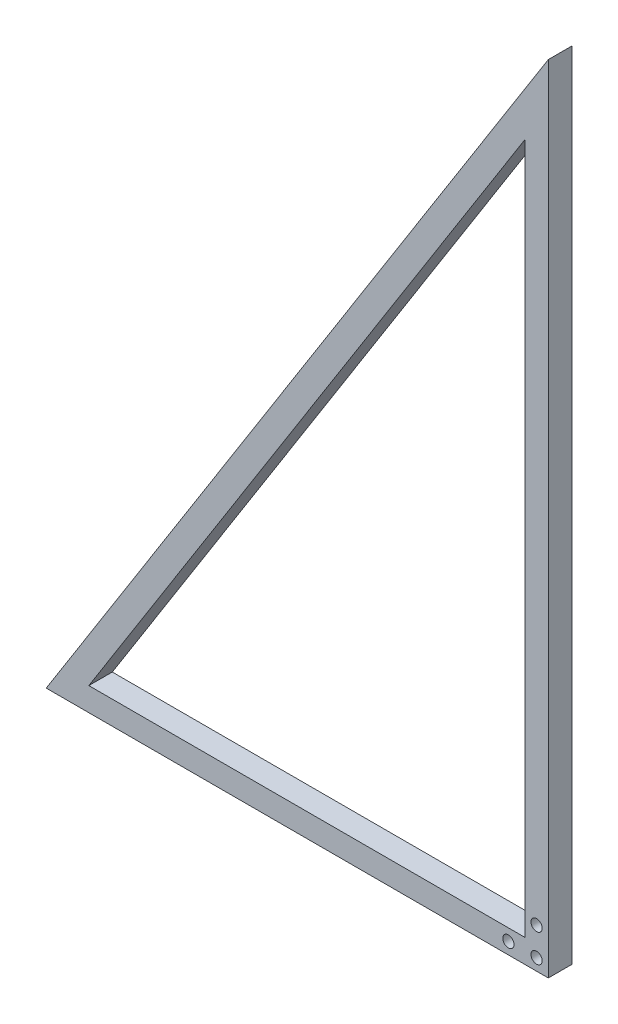
ISO-10303-21;
HEADER;
FILE_DESCRIPTION(('STEP AP214'),'2;1');
FILE_NAME('part.step','',(''),(''),'','','');
FILE_SCHEMA(('AUTOMOTIVE_DESIGN { 1 0 10303 214 1 1 1 1 }'));
ENDSEC;
DATA;
#1=APPLICATION_CONTEXT('core data for automotive mechanical design processes');
#2=APPLICATION_PROTOCOL_DEFINITION('international standard','automotive_design',2000,#1);
#3=PRODUCT_CONTEXT('',#1,'mechanical');
#4=PRODUCT('Part','Part','',(#3));
#5=PRODUCT_RELATED_PRODUCT_CATEGORY('part','',(#4));
#6=PRODUCT_DEFINITION_FORMATION('','',#4);
#7=PRODUCT_DEFINITION_CONTEXT('part definition',#1,'design');
#8=PRODUCT_DEFINITION('design','',#6,#7);
#9=PRODUCT_DEFINITION_SHAPE('','',#8);
#10=(LENGTH_UNIT() NAMED_UNIT(*) SI_UNIT(.MILLI.,.METRE.));
#11=(NAMED_UNIT(*) PLANE_ANGLE_UNIT() SI_UNIT($,.RADIAN.));
#12=(NAMED_UNIT(*) SI_UNIT($,.STERADIAN.) SOLID_ANGLE_UNIT());
#13=UNCERTAINTY_MEASURE_WITH_UNIT(LENGTH_MEASURE(1.E-05),#10,'distance_accuracy_value','');
#14=(GEOMETRIC_REPRESENTATION_CONTEXT(3) GLOBAL_UNCERTAINTY_ASSIGNED_CONTEXT((#13)) GLOBAL_UNIT_ASSIGNED_CONTEXT((#10,
#11,#12)) REPRESENTATION_CONTEXT('',''));
#15=CARTESIAN_POINT('',(0.,0.,0.));
#16=DIRECTION('',(0.,0.,1.));
#17=DIRECTION('',(1.,0.,0.));
#18=AXIS2_PLACEMENT_3D('',#15,#16,#17);
#19=CARTESIAN_POINT('',(-3.12499999999998,100.,3.125));
#20=DIRECTION('',(1.,0.,0.));
#21=DIRECTION('',(0.,1.,0.));
#22=AXIS2_PLACEMENT_3D('',#19,#20,#21);
#23=PLANE('',#22);
#24=DIRECTION('',(0.,-1.,0.));
#25=VECTOR('',#24,1.);
#26=CARTESIAN_POINT('',(-3.12499999999998,100.,3.125));
#27=LINE('',#26,#25);
#28=CARTESIAN_POINT('',(-3.12499999999997,90.0990099009901,3.125));
#29=VERTEX_POINT('',#28);
#30=CARTESIAN_POINT('',(-3.12499999999998,-93.75,3.125));
#31=VERTEX_POINT('',#30);
#32=EDGE_CURVE('E48',#29,#31,#27,.T.);
#33=ORIENTED_EDGE('',*,*,#32,.F.);
#34=DIRECTION('',(0.,0.,-1.));
#35=VECTOR('',#34,1.);
#36=CARTESIAN_POINT('',(-3.12499999999998,90.0990099009901,3.125));
#37=LINE('',#36,#35);
#38=CARTESIAN_POINT('',(-3.12499999999997,90.0990099009901,-3.125));
#39=VERTEX_POINT('',#38);
#40=EDGE_CURVE('E52',#29,#39,#37,.T.);
#41=ORIENTED_EDGE('',*,*,#40,.T.);
#42=DIRECTION('',(0.,-1.,0.));
#43=VECTOR('',#42,1.);
#44=CARTESIAN_POINT('',(-3.12499999999998,100.,-3.125));
#45=LINE('',#44,#43);
#46=CARTESIAN_POINT('',(-3.12499999999998,-93.75,-3.125));
#47=VERTEX_POINT('',#46);
#48=EDGE_CURVE('E132',#39,#47,#45,.T.);
#49=ORIENTED_EDGE('',*,*,#48,.T.);
#50=DIRECTION('',(0.,0.,1.));
#51=VECTOR('',#50,1.);
#52=CARTESIAN_POINT('',(-3.12499999999998,-93.75,-3.125));
#53=LINE('',#52,#51);
#54=EDGE_CURVE('E129',#47,#31,#53,.T.);
#55=ORIENTED_EDGE('',*,*,#54,.T.);
#56=EDGE_LOOP('',(#33,#41,#49,#55));
#57=FACE_BOUND('',#56,.T.);
#58=ADVANCED_FACE('F32',(#57),#23,.F.);
#59=CARTESIAN_POINT('',(-3.12499999999998,-100.,3.125));
#60=DIRECTION('',(0.,1.,0.));
#61=DIRECTION('',(0.,0.,1.));
#62=AXIS2_PLACEMENT_3D('',#59,#60,#61);
#63=PLANE('',#62);
#64=DIRECTION('',(1.,0.,0.));
#65=VECTOR('',#64,1.);
#66=CARTESIAN_POINT('',(-3.12499999999998,-100.,-3.125));
#67=LINE('',#66,#65);
#68=CARTESIAN_POINT('',(-130.516075072184,-100.,-3.125));
#69=VERTEX_POINT('',#68);
#70=CARTESIAN_POINT('',(3.12500000000002,-100.,-3.125));
#71=VERTEX_POINT('',#70);
#72=EDGE_CURVE('E92',#69,#71,#67,.T.);
#73=ORIENTED_EDGE('',*,*,#72,.T.);
#74=DIRECTION('',(0.,0.,-1.));
#75=VECTOR('',#74,1.);
#76=CARTESIAN_POINT('',(3.12500000000002,-100.,3.125));
#77=LINE('',#76,#75);
#78=CARTESIAN_POINT('',(3.12500000000002,-100.,3.125));
#79=VERTEX_POINT('',#78);
#80=EDGE_CURVE('E40',#79,#71,#77,.T.);
#81=ORIENTED_EDGE('',*,*,#80,.F.);
#82=DIRECTION('',(1.,0.,0.));
#83=VECTOR('',#82,1.);
#84=CARTESIAN_POINT('',(-3.12499999999998,-100.,3.125));
#85=LINE('',#84,#83);
#86=CARTESIAN_POINT('',(-130.516075072184,-100.,3.125));
#87=VERTEX_POINT('',#86);
#88=EDGE_CURVE('E309',#87,#79,#85,.T.);
#89=ORIENTED_EDGE('',*,*,#88,.F.);
#90=DIRECTION('',(0.,0.,1.));
#91=VECTOR('',#90,1.);
#92=CARTESIAN_POINT('',(-130.516075072184,-100.,-3.125));
#93=LINE('',#92,#91);
#94=EDGE_CURVE('E100',#69,#87,#93,.T.);
#95=ORIENTED_EDGE('',*,*,#94,.F.);
#96=EDGE_LOOP('',(#73,#81,#89,#95));
#97=FACE_BOUND('',#96,.T.);
#98=ADVANCED_FACE('F171',(#97),#63,.F.);
#99=CARTESIAN_POINT('',(3.12500000000002,100.,3.125));
#100=DIRECTION('',(-1.,0.,0.));
#101=DIRECTION('',(0.,0.,1.));
#102=AXIS2_PLACEMENT_3D('',#99,#100,#101);
#103=PLANE('',#102);
#104=DIRECTION('',(0.,1.,0.));
#105=VECTOR('',#104,1.);
#106=CARTESIAN_POINT('',(3.12500000000002,100.,-3.125));
#107=LINE('',#106,#105);
#108=CARTESIAN_POINT('',(3.12500000000002,111.708633777717,-3.125));
#109=VERTEX_POINT('',#108);
#110=EDGE_CURVE('E84',#71,#109,#107,.T.);
#111=ORIENTED_EDGE('',*,*,#110,.T.);
#112=DIRECTION('',(0.,0.,1.));
#113=VECTOR('',#112,1.);
#114=CARTESIAN_POINT('',(3.12500000000002,111.708633777717,-3.125));
#115=LINE('',#114,#113);
#116=CARTESIAN_POINT('',(3.12500000000002,111.708633777717,3.125));
#117=VERTEX_POINT('',#116);
#118=EDGE_CURVE('E89',#109,#117,#115,.T.);
#119=ORIENTED_EDGE('',*,*,#118,.T.);
#120=DIRECTION('',(0.,1.,0.));
#121=VECTOR('',#120,1.);
#122=CARTESIAN_POINT('',(3.12500000000002,100.,3.125));
#123=LINE('',#122,#121);
#124=EDGE_CURVE('E145',#79,#117,#123,.T.);
#125=ORIENTED_EDGE('',*,*,#124,.F.);
#126=ORIENTED_EDGE('',*,*,#80,.T.);
#127=EDGE_LOOP('',(#111,#119,#125,#126));
#128=FACE_BOUND('',#127,.T.);
#129=ADVANCED_FACE('F86',(#128),#103,.F.);
#130=CARTESIAN_POINT('',(0.,0.,3.125));
#131=DIRECTION('',(0.,0.,1.));
#132=DIRECTION('',(1.,0.,0.));
#133=AXIS2_PLACEMENT_3D('',#130,#131,#132);
#134=PLANE('',#133);
#135=CARTESIAN_POINT('',(-7.49999999999997,-96.875,3.125));
#136=DIRECTION('',(0.,0.,1.));
#137=DIRECTION('',(1.,0.,0.));
#138=AXIS2_PLACEMENT_3D('',#135,#136,#137);
#139=CIRCLE('',#138,1.5);
#140=CARTESIAN_POINT('',(-5.99999999999997,-96.875,3.125));
#141=VERTEX_POINT('',#140);
#142=EDGE_CURVE('E192',#141,#141,#139,.T.);
#143=ORIENTED_EDGE('',*,*,#142,.F.);
#144=EDGE_LOOP('',(#143));
#145=FACE_BOUND('',#144,.T.);
#146=CARTESIAN_POINT('',(0.,-89.375,3.125));
#147=DIRECTION('',(0.,0.,1.));
#148=DIRECTION('',(1.,0.,0.));
#149=AXIS2_PLACEMENT_3D('',#146,#147,#148);
#150=CIRCLE('',#149,1.5);
#151=CARTESIAN_POINT('',(1.5,-89.375,3.125));
#152=VERTEX_POINT('',#151);
#153=EDGE_CURVE('E196',#152,#152,#150,.T.);
#154=ORIENTED_EDGE('',*,*,#153,.F.);
#155=EDGE_LOOP('',(#154));
#156=FACE_BOUND('',#155,.T.);
#157=CARTESIAN_POINT('',(0.,-96.875,3.125));
#158=DIRECTION('',(0.,0.,1.));
#159=DIRECTION('',(1.,0.,0.));
#160=AXIS2_PLACEMENT_3D('',#157,#158,#159);
#161=CIRCLE('',#160,1.5);
#162=CARTESIAN_POINT('',(1.50000000000003,-96.875,3.125));
#163=VERTEX_POINT('',#162);
#164=EDGE_CURVE('E113',#163,#163,#161,.T.);
#165=ORIENTED_EDGE('',*,*,#164,.F.);
#166=EDGE_LOOP('',(#165));
#167=FACE_BOUND('',#166,.T.);
#168=DIRECTION('',(0.533794131634266,0.845614465955272,0.));
#169=VECTOR('',#168,1.);
#170=CARTESIAN_POINT('',(-123.125,-100.,3.125));
#171=LINE('',#170,#169);
#172=CARTESIAN_POINT('',(-119.1796875,-93.75,3.125));
#173=VERTEX_POINT('',#172);
#174=EDGE_CURVE('E107',#173,#29,#171,.T.);
#175=ORIENTED_EDGE('',*,*,#174,.T.);
#176=ORIENTED_EDGE('',*,*,#32,.T.);
#177=DIRECTION('',(-1.,0.,0.));
#178=VECTOR('',#177,1.);
#179=CARTESIAN_POINT('',(-123.125,-93.75,3.125));
#180=LINE('',#179,#178);
#181=EDGE_CURVE('E123',#31,#173,#180,.T.);
#182=ORIENTED_EDGE('',*,*,#181,.T.);
#183=EDGE_LOOP('',(#175,#176,#182));
#184=FACE_BOUND('',#183,.T.);
#185=DIRECTION('',(-0.533794131634265,-0.845614465955272,0.));
#186=VECTOR('',#185,1.);
#187=CARTESIAN_POINT('',(-2.16009041222041,103.336213322714,3.125));
#188=LINE('',#187,#186);
#189=EDGE_CURVE('E106',#117,#87,#188,.T.);
#190=ORIENTED_EDGE('',*,*,#189,.T.);
#191=ORIENTED_EDGE('',*,*,#88,.T.);
#192=ORIENTED_EDGE('',*,*,#124,.T.);
#193=EDGE_LOOP('',(#190,#191,#192));
#194=FACE_BOUND('',#193,.T.);
#195=ADVANCED_FACE('F150',(#145,#156,#167,#184,#194),#134,.T.);
#196=CARTESIAN_POINT('',(0.,0.,-3.125));
#197=DIRECTION('',(0.,0.,1.));
#198=DIRECTION('',(1.,0.,0.));
#199=AXIS2_PLACEMENT_3D('',#196,#197,#198);
#200=PLANE('',#199);
#201=CARTESIAN_POINT('',(-7.49999999999997,-96.875,-3.125));
#202=DIRECTION('',(0.,0.,1.));
#203=DIRECTION('',(1.,0.,0.));
#204=AXIS2_PLACEMENT_3D('',#201,#202,#203);
#205=CIRCLE('',#204,1.5);
#206=CARTESIAN_POINT('',(-5.99999999999997,-96.875,-3.125));
#207=VERTEX_POINT('',#206);
#208=EDGE_CURVE('E35',#207,#207,#205,.T.);
#209=ORIENTED_EDGE('',*,*,#208,.T.);
#210=EDGE_LOOP('',(#209));
#211=FACE_BOUND('',#210,.T.);
#212=CARTESIAN_POINT('',(0.,-89.375,-3.125));
#213=DIRECTION('',(0.,0.,1.));
#214=DIRECTION('',(1.,0.,0.));
#215=AXIS2_PLACEMENT_3D('',#212,#213,#214);
#216=CIRCLE('',#215,1.5);
#217=CARTESIAN_POINT('',(1.5,-89.375,-3.125));
#218=VERTEX_POINT('',#217);
#219=EDGE_CURVE('E200',#218,#218,#216,.T.);
#220=ORIENTED_EDGE('',*,*,#219,.T.);
#221=EDGE_LOOP('',(#220));
#222=FACE_BOUND('',#221,.T.);
#223=CARTESIAN_POINT('',(0.,-96.875,-3.125));
#224=DIRECTION('',(0.,0.,1.));
#225=DIRECTION('',(1.,0.,0.));
#226=AXIS2_PLACEMENT_3D('',#223,#224,#225);
#227=CIRCLE('',#226,1.5);
#228=CARTESIAN_POINT('',(1.50000000000003,-96.875,-3.125));
#229=VERTEX_POINT('',#228);
#230=EDGE_CURVE('E108',#229,#229,#227,.T.);
#231=ORIENTED_EDGE('',*,*,#230,.T.);
#232=EDGE_LOOP('',(#231));
#233=FACE_BOUND('',#232,.T.);
#234=ORIENTED_EDGE('',*,*,#48,.F.);
#235=DIRECTION('',(0.533794131634266,0.845614465955272,0.));
#236=VECTOR('',#235,1.);
#237=CARTESIAN_POINT('',(-123.125,-100.,-3.125));
#238=LINE('',#237,#236);
#239=CARTESIAN_POINT('',(-119.1796875,-93.75,-3.125));
#240=VERTEX_POINT('',#239);
#241=EDGE_CURVE('E101',#240,#39,#238,.T.);
#242=ORIENTED_EDGE('',*,*,#241,.F.);
#243=DIRECTION('',(-1.,0.,0.));
#244=VECTOR('',#243,1.);
#245=CARTESIAN_POINT('',(-123.125,-93.75,-3.125));
#246=LINE('',#245,#244);
#247=EDGE_CURVE('E133',#47,#240,#246,.T.);
#248=ORIENTED_EDGE('',*,*,#247,.F.);
#249=EDGE_LOOP('',(#234,#242,#248));
#250=FACE_BOUND('',#249,.T.);
#251=ORIENTED_EDGE('',*,*,#72,.F.);
#252=DIRECTION('',(-0.533794131634265,-0.845614465955272,0.));
#253=VECTOR('',#252,1.);
#254=CARTESIAN_POINT('',(-2.16009041222041,103.336213322714,-3.125));
#255=LINE('',#254,#253);
#256=EDGE_CURVE('E95',#109,#69,#255,.T.);
#257=ORIENTED_EDGE('',*,*,#256,.F.);
#258=ORIENTED_EDGE('',*,*,#110,.F.);
#259=EDGE_LOOP('',(#251,#257,#258));
#260=FACE_BOUND('',#259,.T.);
#261=ADVANCED_FACE('F96',(#211,#222,#233,#250,#260),#200,.F.);
#262=CARTESIAN_POINT('',(-123.125,-93.75,-3.125));
#263=DIRECTION('',(0.,1.,0.));
#264=DIRECTION('',(-1.,0.,0.));
#265=AXIS2_PLACEMENT_3D('',#262,#263,#264);
#266=PLANE('',#265);
#267=DIRECTION('',(0.,0.,-1.));
#268=VECTOR('',#267,1.);
#269=CARTESIAN_POINT('',(-119.1796875,-93.75,-3.125));
#270=LINE('',#269,#268);
#271=EDGE_CURVE('E11',#173,#240,#270,.T.);
#272=ORIENTED_EDGE('',*,*,#271,.F.);
#273=ORIENTED_EDGE('',*,*,#181,.F.);
#274=ORIENTED_EDGE('',*,*,#54,.F.);
#275=ORIENTED_EDGE('',*,*,#247,.T.);
#276=EDGE_LOOP('',(#272,#273,#274,#275));
#277=FACE_BOUND('',#276,.T.);
#278=ADVANCED_FACE('F155',(#277),#266,.T.);
#279=CARTESIAN_POINT('',(-123.125,-100.,-3.125));
#280=DIRECTION('',(0.845614465955272,-0.533794131634266,0.));
#281=DIRECTION('',(0.533794131634266,0.845614465955272,0.));
#282=AXIS2_PLACEMENT_3D('',#279,#280,#281);
#283=PLANE('',#282);
#284=ORIENTED_EDGE('',*,*,#40,.F.);
#285=ORIENTED_EDGE('',*,*,#174,.F.);
#286=ORIENTED_EDGE('',*,*,#271,.T.);
#287=ORIENTED_EDGE('',*,*,#241,.T.);
#288=EDGE_LOOP('',(#284,#285,#286,#287));
#289=FACE_BOUND('',#288,.T.);
#290=ADVANCED_FACE('F160',(#289),#283,.T.);
#291=CARTESIAN_POINT('',(-2.16009041222041,103.336213322714,-3.125));
#292=DIRECTION('',(-0.845614465955272,0.533794131634265,0.));
#293=DIRECTION('',(-0.533794131634265,-0.845614465955272,0.));
#294=AXIS2_PLACEMENT_3D('',#291,#292,#293);
#295=PLANE('',#294);
#296=ORIENTED_EDGE('',*,*,#189,.F.);
#297=ORIENTED_EDGE('',*,*,#118,.F.);
#298=ORIENTED_EDGE('',*,*,#256,.T.);
#299=ORIENTED_EDGE('',*,*,#94,.T.);
#300=EDGE_LOOP('',(#296,#297,#298,#299));
#301=FACE_BOUND('',#300,.T.);
#302=ADVANCED_FACE('F104',(#301),#295,.T.);
#303=CARTESIAN_POINT('',(0.,-96.875,-13.125));
#304=DIRECTION('',(0.,0.,1.));
#305=DIRECTION('',(1.,0.,0.));
#306=AXIS2_PLACEMENT_3D('',#303,#304,#305);
#307=CYLINDRICAL_SURFACE('',#306,1.5);
#308=ORIENTED_EDGE('',*,*,#164,.T.);
#309=EDGE_LOOP('',(#308));
#310=FACE_BOUND('',#309,.T.);
#311=ORIENTED_EDGE('',*,*,#230,.F.);
#312=EDGE_LOOP('',(#311));
#313=FACE_BOUND('',#312,.T.);
#314=ADVANCED_FACE('F167',(#310,#313),#307,.F.);
#315=CARTESIAN_POINT('',(0.,-89.375,-13.125));
#316=DIRECTION('',(0.,0.,1.));
#317=DIRECTION('',(1.,0.,0.));
#318=AXIS2_PLACEMENT_3D('',#315,#316,#317);
#319=CYLINDRICAL_SURFACE('',#318,1.5);
#320=ORIENTED_EDGE('',*,*,#153,.T.);
#321=EDGE_LOOP('',(#320));
#322=FACE_BOUND('',#321,.T.);
#323=ORIENTED_EDGE('',*,*,#219,.F.);
#324=EDGE_LOOP('',(#323));
#325=FACE_BOUND('',#324,.T.);
#326=ADVANCED_FACE('F211',(#322,#325),#319,.F.);
#327=CARTESIAN_POINT('',(-7.49999999999997,-96.875,-13.125));
#328=DIRECTION('',(0.,0.,1.));
#329=DIRECTION('',(1.,0.,0.));
#330=AXIS2_PLACEMENT_3D('',#327,#328,#329);
#331=CYLINDRICAL_SURFACE('',#330,1.5);
#332=ORIENTED_EDGE('',*,*,#142,.T.);
#333=EDGE_LOOP('',(#332));
#334=FACE_BOUND('',#333,.T.);
#335=ORIENTED_EDGE('',*,*,#208,.F.);
#336=EDGE_LOOP('',(#335));
#337=FACE_BOUND('',#336,.T.);
#338=ADVANCED_FACE('F208',(#334,#337),#331,.F.);
#339=CLOSED_SHELL('',(#58,#98,#129,#195,#261,#278,#290,#302,#314,#326,#338));
#340=MANIFOLD_SOLID_BREP('B2',#339);
#341=ADVANCED_BREP_SHAPE_REPRESENTATION('',(#18,#340),#14);
#342=SHAPE_DEFINITION_REPRESENTATION(#9,#341);
ENDSEC;
END-ISO-10303-21;
